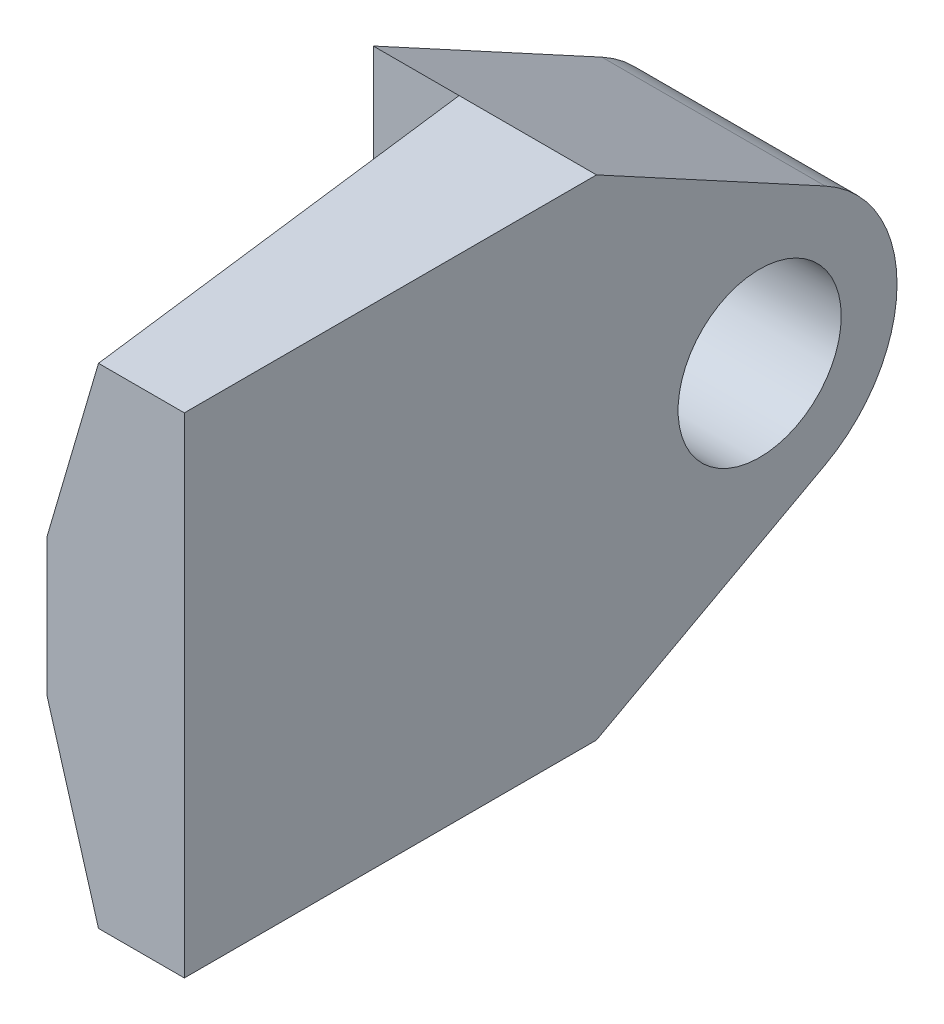
ISO-10303-21;
HEADER;
FILE_DESCRIPTION(('STEP AP214'),'2;1');
FILE_NAME('part.step','',(''),(''),'','','');
FILE_SCHEMA(('AUTOMOTIVE_DESIGN { 1 0 10303 214 1 1 1 1 }'));
ENDSEC;
DATA;
#1=APPLICATION_CONTEXT('core data for automotive mechanical design processes');
#2=APPLICATION_PROTOCOL_DEFINITION('international standard','automotive_design',2000,#1);
#3=PRODUCT_CONTEXT('',#1,'mechanical');
#4=PRODUCT('Part','Part','',(#3));
#5=PRODUCT_RELATED_PRODUCT_CATEGORY('part','',(#4));
#6=PRODUCT_DEFINITION_FORMATION('','',#4);
#7=PRODUCT_DEFINITION_CONTEXT('part definition',#1,'design');
#8=PRODUCT_DEFINITION('design','',#6,#7);
#9=PRODUCT_DEFINITION_SHAPE('','',#8);
#10=(LENGTH_UNIT() NAMED_UNIT(*) SI_UNIT(.MILLI.,.METRE.));
#11=(NAMED_UNIT(*) PLANE_ANGLE_UNIT() SI_UNIT($,.RADIAN.));
#12=(NAMED_UNIT(*) SI_UNIT($,.STERADIAN.) SOLID_ANGLE_UNIT());
#13=UNCERTAINTY_MEASURE_WITH_UNIT(LENGTH_MEASURE(1.E-05),#10,'distance_accuracy_value','');
#14=(GEOMETRIC_REPRESENTATION_CONTEXT(3) GLOBAL_UNCERTAINTY_ASSIGNED_CONTEXT((#13)) GLOBAL_UNIT_ASSIGNED_CONTEXT((#10,
#11,#12)) REPRESENTATION_CONTEXT('',''));
#15=CARTESIAN_POINT('',(0.,0.,0.));
#16=DIRECTION('',(0.,0.,1.));
#17=DIRECTION('',(1.,0.,0.));
#18=AXIS2_PLACEMENT_3D('',#15,#16,#17);
#19=CARTESIAN_POINT('',(-32.,0.,-96.));
#20=DIRECTION('',(0.,-1.,0.));
#21=DIRECTION('',(0.,0.,-1.));
#22=AXIS2_PLACEMENT_3D('',#19,#20,#21);
#23=PLANE('',#22);
#24=DIRECTION('',(1.,0.,0.));
#25=VECTOR('',#24,1.);
#26=CARTESIAN_POINT('',(-32.,0.,0.));
#27=LINE('',#26,#25);
#28=CARTESIAN_POINT('',(-20.,0.,0.));
#29=VERTEX_POINT('',#28);
#30=CARTESIAN_POINT('',(0.,0.,0.));
#31=VERTEX_POINT('',#30);
#32=EDGE_CURVE('E156',#29,#31,#27,.T.);
#33=ORIENTED_EDGE('',*,*,#32,.F.);
#34=DIRECTION('',(0.124034734589208,0.,0.992277876713668));
#35=VECTOR('',#34,1.);
#36=CARTESIAN_POINT('',(-20.,0.,0.));
#37=LINE('',#36,#35);
#38=CARTESIAN_POINT('',(-32.,0.,-96.));
#39=VERTEX_POINT('',#38);
#40=EDGE_CURVE('E55',#39,#29,#37,.T.);
#41=ORIENTED_EDGE('',*,*,#40,.F.);
#42=DIRECTION('',(1.,0.,0.));
#43=VECTOR('',#42,1.);
#44=CARTESIAN_POINT('',(-32.,0.,-96.));
#45=LINE('',#44,#43);
#46=CARTESIAN_POINT('',(0.,0.,-96.));
#47=VERTEX_POINT('',#46);
#48=EDGE_CURVE('E105',#39,#47,#45,.T.);
#49=ORIENTED_EDGE('',*,*,#48,.T.);
#50=DIRECTION('',(0.,0.,1.));
#51=VECTOR('',#50,1.);
#52=CARTESIAN_POINT('',(0.,0.,-96.));
#53=LINE('',#52,#51);
#54=EDGE_CURVE('E36',#47,#31,#53,.T.);
#55=ORIENTED_EDGE('',*,*,#54,.T.);
#56=EDGE_LOOP('',(#33,#41,#49,#55));
#57=FACE_BOUND('',#56,.T.);
#58=ADVANCED_FACE('F33',(#57),#23,.T.);
#59=CARTESIAN_POINT('',(-32.,0.,-96.));
#60=DIRECTION('',(1.,0.,0.));
#61=DIRECTION('',(0.,0.,-1.));
#62=AXIS2_PLACEMENT_3D('',#59,#60,#61);
#63=PLANE('',#62);
#64=DIRECTION('',(0.,1.,0.));
#65=VECTOR('',#64,1.);
#66=CARTESIAN_POINT('',(-32.,0.,0.));
#67=LINE('',#66,#65);
#68=CARTESIAN_POINT('',(-32.,40.9999999999999,0.));
#69=VERTEX_POINT('',#68);
#70=CARTESIAN_POINT('',(-32.,73.,0.));
#71=VERTEX_POINT('',#70);
#72=EDGE_CURVE('E159',#69,#71,#67,.T.);
#73=ORIENTED_EDGE('',*,*,#72,.T.);
#74=DIRECTION('',(0.,-0.392762830591031,0.919639798457048));
#75=VECTOR('',#74,1.);
#76=CARTESIAN_POINT('',(-32.,114.,-96.));
#77=LINE('',#76,#75);
#78=CARTESIAN_POINT('',(-32.,114.,-96.));
#79=VERTEX_POINT('',#78);
#80=EDGE_CURVE('E148',#79,#71,#77,.T.);
#81=ORIENTED_EDGE('',*,*,#80,.F.);
#82=DIRECTION('',(0.,1.,0.));
#83=VECTOR('',#82,1.);
#84=CARTESIAN_POINT('',(-32.,0.,-96.));
#85=LINE('',#84,#83);
#86=EDGE_CURVE('E162',#39,#79,#85,.T.);
#87=ORIENTED_EDGE('',*,*,#86,.F.);
#88=DIRECTION('',(0.,-0.392762830591031,-0.919639798457049));
#89=VECTOR('',#88,1.);
#90=CARTESIAN_POINT('',(-32.,0.,-96.));
#91=LINE('',#90,#89);
#92=EDGE_CURVE('E154',#69,#39,#91,.T.);
#93=ORIENTED_EDGE('',*,*,#92,.F.);
#94=EDGE_LOOP('',(#73,#81,#87,#93));
#95=FACE_BOUND('',#94,.T.);
#96=ADVANCED_FACE('F175',(#95),#63,.F.);
#97=CARTESIAN_POINT('',(0.,0.,0.));
#98=DIRECTION('',(0.,0.,1.));
#99=DIRECTION('',(1.,0.,0.));
#100=AXIS2_PLACEMENT_3D('',#97,#98,#99);
#101=PLANE('',#100);
#102=DIRECTION('',(0.280898753270713,0.959737407008271,0.));
#103=VECTOR('',#102,1.);
#104=CARTESIAN_POINT('',(-32.,73.,0.));
#105=LINE('',#104,#103);
#106=CARTESIAN_POINT('',(-20.,114.,0.));
#107=VERTEX_POINT('',#106);
#108=EDGE_CURVE('E47',#71,#107,#105,.T.);
#109=ORIENTED_EDGE('',*,*,#108,.F.);
#110=ORIENTED_EDGE('',*,*,#72,.F.);
#111=DIRECTION('',(-0.280898753270713,0.959737407008271,0.));
#112=VECTOR('',#111,1.);
#113=CARTESIAN_POINT('',(-32.,41.,0.));
#114=LINE('',#113,#112);
#115=EDGE_CURVE('E152',#29,#69,#114,.T.);
#116=ORIENTED_EDGE('',*,*,#115,.F.);
#117=ORIENTED_EDGE('',*,*,#32,.T.);
#118=DIRECTION('',(0.,1.,0.));
#119=VECTOR('',#118,1.);
#120=CARTESIAN_POINT('',(0.,0.,0.));
#121=LINE('',#120,#119);
#122=CARTESIAN_POINT('',(0.,114.,0.));
#123=VERTEX_POINT('',#122);
#124=EDGE_CURVE('E165',#31,#123,#121,.T.);
#125=ORIENTED_EDGE('',*,*,#124,.T.);
#126=DIRECTION('',(1.,0.,0.));
#127=VECTOR('',#126,1.);
#128=CARTESIAN_POINT('',(-32.,114.,0.));
#129=LINE('',#128,#127);
#130=EDGE_CURVE('E168',#107,#123,#129,.T.);
#131=ORIENTED_EDGE('',*,*,#130,.F.);
#132=EDGE_LOOP('',(#109,#110,#116,#117,#125,#131));
#133=FACE_BOUND('',#132,.T.);
#134=ADVANCED_FACE('F178',(#133),#101,.T.);
#135=CARTESIAN_POINT('',(-32.,114.,-96.));
#136=DIRECTION('',(0.,-1.,0.));
#137=DIRECTION('',(0.,0.,-1.));
#138=AXIS2_PLACEMENT_3D('',#135,#136,#137);
#139=PLANE('',#138);
#140=DIRECTION('',(1.,0.,0.));
#141=VECTOR('',#140,1.);
#142=CARTESIAN_POINT('',(-32.,114.,-96.));
#143=LINE('',#142,#141);
#144=CARTESIAN_POINT('',(0.,114.,-96.));
#145=VERTEX_POINT('',#144);
#146=EDGE_CURVE('E158',#79,#145,#143,.T.);
#147=ORIENTED_EDGE('',*,*,#146,.F.);
#148=DIRECTION('',(-0.124034734589208,0.,-0.992277876713668));
#149=VECTOR('',#148,1.);
#150=CARTESIAN_POINT('',(-20.,114.,0.));
#151=LINE('',#150,#149);
#152=EDGE_CURVE('E143',#107,#79,#151,.T.);
#153=ORIENTED_EDGE('',*,*,#152,.F.);
#154=ORIENTED_EDGE('',*,*,#130,.T.);
#155=DIRECTION('',(0.,0.,1.));
#156=VECTOR('',#155,1.);
#157=CARTESIAN_POINT('',(0.,114.,-96.));
#158=LINE('',#157,#156);
#159=EDGE_CURVE('E11',#145,#123,#158,.T.);
#160=ORIENTED_EDGE('',*,*,#159,.F.);
#161=EDGE_LOOP('',(#147,#153,#154,#160));
#162=FACE_BOUND('',#161,.T.);
#163=ADVANCED_FACE('F183',(#162),#139,.F.);
#164=CARTESIAN_POINT('',(0.,0.,-96.));
#165=DIRECTION('',(1.,0.,0.));
#166=DIRECTION('',(0.,0.,-1.));
#167=AXIS2_PLACEMENT_3D('',#164,#165,#166);
#168=PLANE('',#167);
#169=ORIENTED_EDGE('',*,*,#124,.F.);
#170=ORIENTED_EDGE('',*,*,#54,.F.);
#171=DIRECTION('',(0.,0.476586286036007,-0.879127699462601));
#172=VECTOR('',#171,1.);
#173=CARTESIAN_POINT('',(0.,0.,-96.));
#174=LINE('',#173,#172);
#175=CARTESIAN_POINT('',(0.,28.8679136171968,-149.250761153152));
#176=VERTEX_POINT('',#175);
#177=EDGE_CURVE('E136',#47,#176,#174,.T.);
#178=ORIENTED_EDGE('',*,*,#177,.T.);
#179=CARTESIAN_POINT('',(0.,57.,-134.));
#180=DIRECTION('',(1.,0.,0.));
#181=DIRECTION('',(0.,0.,-1.));
#182=AXIS2_PLACEMENT_3D('',#179,#180,#181);
#183=CIRCLE('',#182,32.);
#184=CARTESIAN_POINT('',(0.,85.1320863828032,-149.250761153152));
#185=VERTEX_POINT('',#184);
#186=EDGE_CURVE('E128',#176,#185,#183,.T.);
#187=ORIENTED_EDGE('',*,*,#186,.T.);
#188=DIRECTION('',(0.,0.476586286036007,0.879127699462601));
#189=VECTOR('',#188,1.);
#190=CARTESIAN_POINT('',(0.,114.,-96.));
#191=LINE('',#190,#189);
#192=EDGE_CURVE('E125',#185,#145,#191,.T.);
#193=ORIENTED_EDGE('',*,*,#192,.T.);
#194=ORIENTED_EDGE('',*,*,#159,.T.);
#195=EDGE_LOOP('',(#169,#170,#178,#187,#193,#194));
#196=FACE_BOUND('',#195,.T.);
#197=CARTESIAN_POINT('',(0.,57.,-134.));
#198=DIRECTION('',(1.,0.,0.));
#199=DIRECTION('',(0.,0.,-1.));
#200=AXIS2_PLACEMENT_3D('',#197,#198,#199);
#201=CIRCLE('',#200,19.);
#202=CARTESIAN_POINT('',(0.,57.,-153.));
#203=VERTEX_POINT('',#202);
#204=EDGE_CURVE('E131',#203,#203,#201,.T.);
#205=ORIENTED_EDGE('',*,*,#204,.F.);
#206=EDGE_LOOP('',(#205));
#207=FACE_BOUND('',#206,.T.);
#208=ADVANCED_FACE('F185',(#196,#207),#168,.T.);
#209=CARTESIAN_POINT('',(-18.1605489487766,-5.31528261915413,2.27006861859708));
#210=DIRECTION('',(-0.952904742059158,-0.278898948895363,0.119113092757395));
#211=DIRECTION('',(0.280898753270713,-0.95973740700827,0.));
#212=AXIS2_PLACEMENT_3D('',#209,#210,#211);
#213=PLANE('',#212);
#214=ORIENTED_EDGE('',*,*,#40,.T.);
#215=ORIENTED_EDGE('',*,*,#115,.T.);
#216=ORIENTED_EDGE('',*,*,#92,.T.);
#217=EDGE_LOOP('',(#214,#215,#216));
#218=FACE_BOUND('',#217,.T.);
#219=ADVANCED_FACE('F208',(#218),#213,.T.);
#220=CARTESIAN_POINT('',(-48.4576598779551,14.1827297203771,6.05720748474439));
#221=DIRECTION('',(0.952904742059158,-0.278898948895363,-0.119113092757395));
#222=DIRECTION('',(0.280898753270713,0.95973740700827,0.));
#223=AXIS2_PLACEMENT_3D('',#220,#221,#222);
#224=PLANE('',#223);
#225=ORIENTED_EDGE('',*,*,#152,.T.);
#226=ORIENTED_EDGE('',*,*,#80,.T.);
#227=ORIENTED_EDGE('',*,*,#108,.T.);
#228=EDGE_LOOP('',(#225,#226,#227));
#229=FACE_BOUND('',#228,.T.);
#230=ADVANCED_FACE('F212',(#229),#224,.F.);
#231=CARTESIAN_POINT('',(-52.,0.,-96.));
#232=DIRECTION('',(0.,0.,1.));
#233=DIRECTION('',(1.,0.,0.));
#234=AXIS2_PLACEMENT_3D('',#231,#232,#233);
#235=PLANE('',#234);
#236=DIRECTION('',(1.,0.,0.));
#237=VECTOR('',#236,1.);
#238=CARTESIAN_POINT('',(-52.,0.,-96.));
#239=LINE('',#238,#237);
#240=CARTESIAN_POINT('',(-52.,0.,-96.));
#241=VERTEX_POINT('',#240);
#242=EDGE_CURVE('E99',#241,#39,#239,.T.);
#243=ORIENTED_EDGE('',*,*,#242,.T.);
#244=ORIENTED_EDGE('',*,*,#86,.T.);
#245=DIRECTION('',(1.,0.,0.));
#246=VECTOR('',#245,1.);
#247=CARTESIAN_POINT('',(-52.,114.,-96.));
#248=LINE('',#247,#246);
#249=CARTESIAN_POINT('',(-52.,114.,-96.));
#250=VERTEX_POINT('',#249);
#251=EDGE_CURVE('E124',#250,#79,#248,.T.);
#252=ORIENTED_EDGE('',*,*,#251,.F.);
#253=DIRECTION('',(0.,-1.,0.));
#254=VECTOR('',#253,1.);
#255=CARTESIAN_POINT('',(-52.,0.,-96.));
#256=LINE('',#255,#254);
#257=EDGE_CURVE('E117',#250,#241,#256,.T.);
#258=ORIENTED_EDGE('',*,*,#257,.T.);
#259=EDGE_LOOP('',(#243,#244,#252,#258));
#260=FACE_BOUND('',#259,.T.);
#261=ADVANCED_FACE('F122',(#260),#235,.T.);
#262=CARTESIAN_POINT('',(-52.,114.,-96.));
#263=DIRECTION('',(0.,0.879127699462601,-0.476586286036007));
#264=DIRECTION('',(0.,0.476586286036007,0.879127699462601));
#265=AXIS2_PLACEMENT_3D('',#262,#263,#264);
#266=PLANE('',#265);
#267=ORIENTED_EDGE('',*,*,#192,.F.);
#268=DIRECTION('',(1.,0.,0.));
#269=VECTOR('',#268,1.);
#270=CARTESIAN_POINT('',(-52.,85.1320863828032,-149.250761153152));
#271=LINE('',#270,#269);
#272=CARTESIAN_POINT('',(-52.,85.1320863828032,-149.250761153152));
#273=VERTEX_POINT('',#272);
#274=EDGE_CURVE('E144',#273,#185,#271,.T.);
#275=ORIENTED_EDGE('',*,*,#274,.F.);
#276=DIRECTION('',(0.,0.476586286036007,0.879127699462601));
#277=VECTOR('',#276,1.);
#278=CARTESIAN_POINT('',(-52.,114.,-96.));
#279=LINE('',#278,#277);
#280=EDGE_CURVE('E110',#273,#250,#279,.T.);
#281=ORIENTED_EDGE('',*,*,#280,.T.);
#282=ORIENTED_EDGE('',*,*,#251,.T.);
#283=ORIENTED_EDGE('',*,*,#146,.T.);
#284=EDGE_LOOP('',(#267,#275,#281,#282,#283));
#285=FACE_BOUND('',#284,.T.);
#286=ADVANCED_FACE('F190',(#285),#266,.T.);
#287=CARTESIAN_POINT('',(-52.,57.,-134.));
#288=DIRECTION('',(1.,0.,0.));
#289=DIRECTION('',(0.,0.,-1.));
#290=AXIS2_PLACEMENT_3D('',#287,#288,#289);
#291=CYLINDRICAL_SURFACE('',#290,32.);
#292=ORIENTED_EDGE('',*,*,#186,.F.);
#293=DIRECTION('',(1.,0.,0.));
#294=VECTOR('',#293,1.);
#295=CARTESIAN_POINT('',(-52.,28.8679136171968,-149.250761153152));
#296=LINE('',#295,#294);
#297=CARTESIAN_POINT('',(-52.,28.8679136171968,-149.250761153152));
#298=VERTEX_POINT('',#297);
#299=EDGE_CURVE('E109',#298,#176,#296,.T.);
#300=ORIENTED_EDGE('',*,*,#299,.F.);
#301=CARTESIAN_POINT('',(-52.,57.,-134.));
#302=DIRECTION('',(1.,0.,0.));
#303=DIRECTION('',(0.,0.,-1.));
#304=AXIS2_PLACEMENT_3D('',#301,#302,#303);
#305=CIRCLE('',#304,32.);
#306=EDGE_CURVE('E120',#298,#273,#305,.T.);
#307=ORIENTED_EDGE('',*,*,#306,.T.);
#308=ORIENTED_EDGE('',*,*,#274,.T.);
#309=EDGE_LOOP('',(#292,#300,#307,#308));
#310=FACE_BOUND('',#309,.T.);
#311=ADVANCED_FACE('F192',(#310),#291,.T.);
#312=CARTESIAN_POINT('',(-52.,0.,-96.));
#313=DIRECTION('',(0.,-0.879127699462601,-0.476586286036007));
#314=DIRECTION('',(0.,0.476586286036007,-0.879127699462601));
#315=AXIS2_PLACEMENT_3D('',#312,#313,#314);
#316=PLANE('',#315);
#317=ORIENTED_EDGE('',*,*,#177,.F.);
#318=ORIENTED_EDGE('',*,*,#48,.F.);
#319=ORIENTED_EDGE('',*,*,#242,.F.);
#320=DIRECTION('',(0.,0.476586286036007,-0.879127699462601));
#321=VECTOR('',#320,1.);
#322=CARTESIAN_POINT('',(-52.,0.,-96.));
#323=LINE('',#322,#321);
#324=EDGE_CURVE('E103',#241,#298,#323,.T.);
#325=ORIENTED_EDGE('',*,*,#324,.T.);
#326=ORIENTED_EDGE('',*,*,#299,.T.);
#327=EDGE_LOOP('',(#317,#318,#319,#325,#326));
#328=FACE_BOUND('',#327,.T.);
#329=ADVANCED_FACE('F102',(#328),#316,.T.);
#330=CARTESIAN_POINT('',(-52.,57.,-134.));
#331=DIRECTION('',(1.,0.,0.));
#332=DIRECTION('',(0.,0.,-1.));
#333=AXIS2_PLACEMENT_3D('',#330,#331,#332);
#334=PLANE('',#333);
#335=CARTESIAN_POINT('',(-52.,57.,-134.));
#336=DIRECTION('',(1.,0.,0.));
#337=DIRECTION('',(0.,0.,-1.));
#338=AXIS2_PLACEMENT_3D('',#335,#336,#337);
#339=CIRCLE('',#338,19.);
#340=CARTESIAN_POINT('',(-52.,57.,-153.));
#341=VERTEX_POINT('',#340);
#342=EDGE_CURVE('E139',#341,#341,#339,.T.);
#343=ORIENTED_EDGE('',*,*,#342,.T.);
#344=EDGE_LOOP('',(#343));
#345=FACE_BOUND('',#344,.T.);
#346=ORIENTED_EDGE('',*,*,#257,.F.);
#347=ORIENTED_EDGE('',*,*,#280,.F.);
#348=ORIENTED_EDGE('',*,*,#306,.F.);
#349=ORIENTED_EDGE('',*,*,#324,.F.);
#350=EDGE_LOOP('',(#346,#347,#348,#349));
#351=FACE_BOUND('',#350,.T.);
#352=ADVANCED_FACE('F115',(#345,#351),#334,.F.);
#353=CARTESIAN_POINT('',(-52.,57.,-134.));
#354=DIRECTION('',(1.,0.,0.));
#355=DIRECTION('',(0.,0.,-1.));
#356=AXIS2_PLACEMENT_3D('',#353,#354,#355);
#357=CYLINDRICAL_SURFACE('',#356,19.);
#358=ORIENTED_EDGE('',*,*,#342,.F.);
#359=EDGE_LOOP('',(#358));
#360=FACE_BOUND('',#359,.T.);
#361=ORIENTED_EDGE('',*,*,#204,.T.);
#362=EDGE_LOOP('',(#361));
#363=FACE_BOUND('',#362,.T.);
#364=ADVANCED_FACE('F228',(#360,#363),#357,.F.);
#365=CLOSED_SHELL('',(#58,#96,#134,#163,#208,#219,#230,#261,#286,#311,#329,#352,#364));
#366=MANIFOLD_SOLID_BREP('B2',#365);
#367=ADVANCED_BREP_SHAPE_REPRESENTATION('',(#18,#366),#14);
#368=SHAPE_DEFINITION_REPRESENTATION(#9,#367);
ENDSEC;
END-ISO-10303-21;
